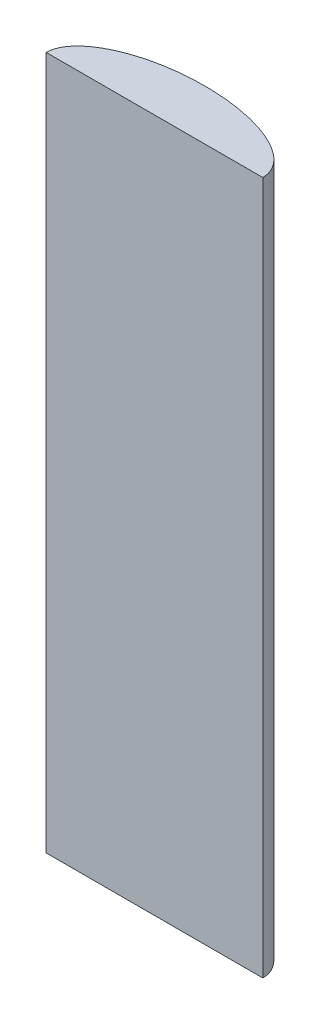
ISO-10303-21;
HEADER;
FILE_DESCRIPTION(('STEP AP214'),'2;1');
FILE_NAME('part.step','',(''),(''),'','','');
FILE_SCHEMA(('AUTOMOTIVE_DESIGN { 1 0 10303 214 1 1 1 1 }'));
ENDSEC;
DATA;
#1=APPLICATION_CONTEXT('core data for automotive mechanical design processes');
#2=APPLICATION_PROTOCOL_DEFINITION('international standard','automotive_design',2000,#1);
#3=PRODUCT_CONTEXT('',#1,'mechanical');
#4=PRODUCT('Part','Part','',(#3));
#5=PRODUCT_RELATED_PRODUCT_CATEGORY('part','',(#4));
#6=PRODUCT_DEFINITION_FORMATION('','',#4);
#7=PRODUCT_DEFINITION_CONTEXT('part definition',#1,'design');
#8=PRODUCT_DEFINITION('design','',#6,#7);
#9=PRODUCT_DEFINITION_SHAPE('','',#8);
#10=(LENGTH_UNIT() NAMED_UNIT(*) SI_UNIT(.MILLI.,.METRE.));
#11=(NAMED_UNIT(*) PLANE_ANGLE_UNIT() SI_UNIT($,.RADIAN.));
#12=(NAMED_UNIT(*) SI_UNIT($,.STERADIAN.) SOLID_ANGLE_UNIT());
#13=UNCERTAINTY_MEASURE_WITH_UNIT(LENGTH_MEASURE(1.E-05),#10,'distance_accuracy_value','');
#14=(GEOMETRIC_REPRESENTATION_CONTEXT(3) GLOBAL_UNCERTAINTY_ASSIGNED_CONTEXT((#13)) GLOBAL_UNIT_ASSIGNED_CONTEXT((#10,
#11,#12)) REPRESENTATION_CONTEXT('',''));
#15=CARTESIAN_POINT('',(0.,0.,0.));
#16=DIRECTION('',(0.,0.,1.));
#17=DIRECTION('',(1.,0.,0.));
#18=AXIS2_PLACEMENT_3D('',#15,#16,#17);
#19=CARTESIAN_POINT('',(127.,812.8,0.));
#20=DIRECTION('',(0.,1.,0.));
#21=DIRECTION('',(1.,0.,0.));
#22=AXIS2_PLACEMENT_3D('',#19,#20,#21);
#23=ELLIPSE('',#22,127.,58.994025070087);
#24=DIRECTION('',(0.,-1.,0.));
#25=VECTOR('',#24,1.);
#26=SURFACE_OF_LINEAR_EXTRUSION('',#23,#25);
#27=CARTESIAN_POINT('',(127.,0.,0.));
#28=DIRECTION('',(0.,1.,0.));
#29=DIRECTION('',(1.,0.,0.));
#30=AXIS2_PLACEMENT_3D('',#27,#28,#29);
#31=ELLIPSE('',#30,127.,58.994025070087);
#32=CARTESIAN_POINT('',(254.,0.,0.));
#33=VERTEX_POINT('',#32);
#34=CARTESIAN_POINT('',(0.,0.,0.));
#35=VERTEX_POINT('',#34);
#36=EDGE_CURVE('E68',#33,#35,#31,.T.);
#37=ORIENTED_EDGE('',*,*,#36,.T.);
#38=DIRECTION('',(0.,-1.,0.));
#39=VECTOR('',#38,1.);
#40=CARTESIAN_POINT('',(0.,812.8,0.));
#41=LINE('',#40,#39);
#42=CARTESIAN_POINT('',(0.,812.8,0.));
#43=VERTEX_POINT('',#42);
#44=EDGE_CURVE('E11',#43,#35,#41,.T.);
#45=ORIENTED_EDGE('',*,*,#44,.F.);
#46=CARTESIAN_POINT('',(254.,812.8,0.));
#47=VERTEX_POINT('',#46);
#48=EDGE_CURVE('E67',#47,#43,#23,.T.);
#49=ORIENTED_EDGE('',*,*,#48,.F.);
#50=DIRECTION('',(0.,-1.,0.));
#51=VECTOR('',#50,1.);
#52=CARTESIAN_POINT('',(254.,812.8,0.));
#53=LINE('',#52,#51);
#54=EDGE_CURVE('E45',#47,#33,#53,.T.);
#55=ORIENTED_EDGE('',*,*,#54,.T.);
#56=EDGE_LOOP('',(#37,#45,#49,#55));
#57=FACE_BOUND('',#56,.T.);
#58=ADVANCED_FACE('F36',(#57),#26,.F.);
#59=CARTESIAN_POINT('',(0.,812.8,0.));
#60=DIRECTION('',(0.,0.,-1.));
#61=DIRECTION('',(-1.,0.,0.));
#62=AXIS2_PLACEMENT_3D('',#59,#60,#61);
#63=PLANE('',#62);
#64=DIRECTION('',(1.,0.,0.));
#65=VECTOR('',#64,1.);
#66=CARTESIAN_POINT('',(0.,0.,0.));
#67=LINE('',#66,#65);
#68=EDGE_CURVE('E60',#35,#33,#67,.T.);
#69=ORIENTED_EDGE('',*,*,#68,.T.);
#70=ORIENTED_EDGE('',*,*,#54,.F.);
#71=DIRECTION('',(1.,0.,0.));
#72=VECTOR('',#71,1.);
#73=CARTESIAN_POINT('',(0.,812.8,0.));
#74=LINE('',#73,#72);
#75=EDGE_CURVE('E52',#43,#47,#74,.T.);
#76=ORIENTED_EDGE('',*,*,#75,.F.);
#77=ORIENTED_EDGE('',*,*,#44,.T.);
#78=EDGE_LOOP('',(#69,#70,#76,#77));
#79=FACE_BOUND('',#78,.T.);
#80=ADVANCED_FACE('F63',(#79),#63,.F.);
#81=CARTESIAN_POINT('',(127.,812.8,0.));
#82=DIRECTION('',(0.,1.,0.));
#83=DIRECTION('',(0.,0.,1.));
#84=AXIS2_PLACEMENT_3D('',#81,#82,#83);
#85=PLANE('',#84);
#86=ORIENTED_EDGE('',*,*,#48,.T.);
#87=ORIENTED_EDGE('',*,*,#75,.T.);
#88=EDGE_LOOP('',(#86,#87));
#89=FACE_BOUND('',#88,.T.);
#90=ADVANCED_FACE('F75',(#89),#85,.T.);
#91=CARTESIAN_POINT('',(127.,0.,0.));
#92=DIRECTION('',(0.,1.,0.));
#93=DIRECTION('',(0.,0.,1.));
#94=AXIS2_PLACEMENT_3D('',#91,#92,#93);
#95=PLANE('',#94);
#96=ORIENTED_EDGE('',*,*,#36,.F.);
#97=ORIENTED_EDGE('',*,*,#68,.F.);
#98=EDGE_LOOP('',(#96,#97));
#99=FACE_BOUND('',#98,.T.);
#100=ADVANCED_FACE('F71',(#99),#95,.F.);
#101=CLOSED_SHELL('',(#58,#80,#90,#100));
#102=MANIFOLD_SOLID_BREP('B2',#101);
#103=ADVANCED_BREP_SHAPE_REPRESENTATION('',(#18,#102),#14);
#104=SHAPE_DEFINITION_REPRESENTATION(#9,#103);
ENDSEC;
END-ISO-10303-21;
